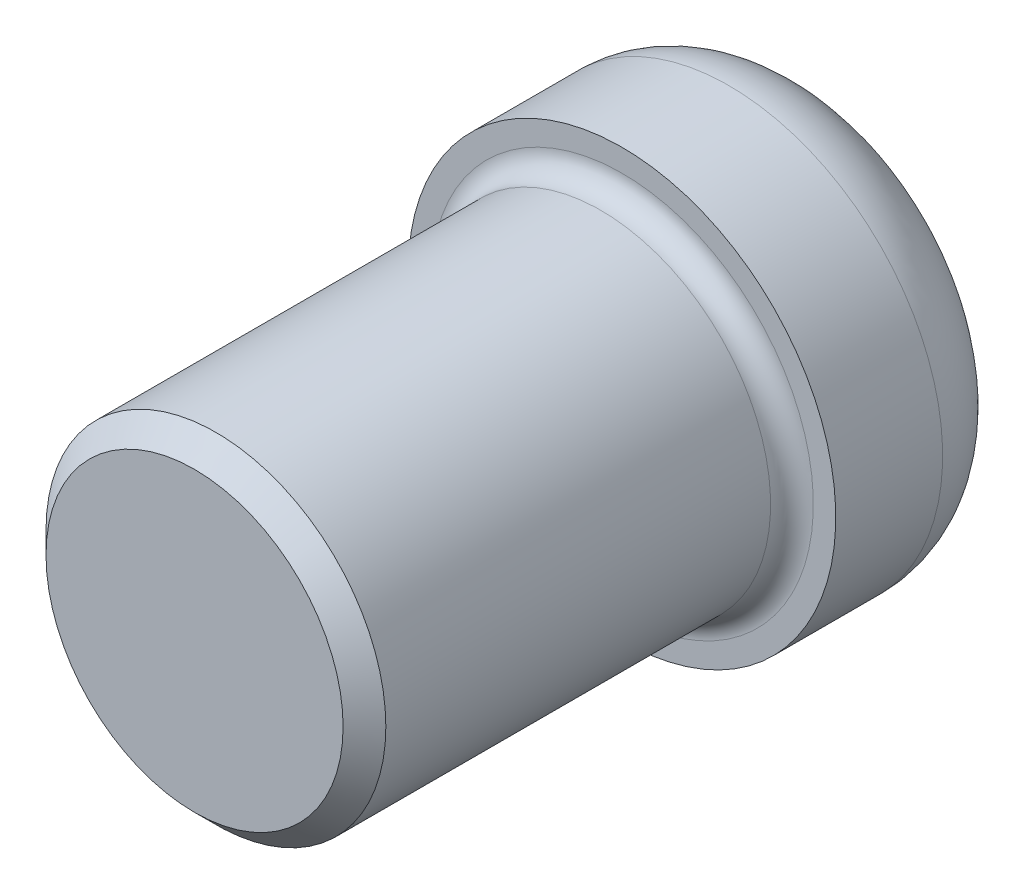
ISO-10303-21;
HEADER;
FILE_DESCRIPTION(('STEP AP214'),'2;1');
FILE_NAME('part.step','',(''),(''),'','','');
FILE_SCHEMA(('AUTOMOTIVE_DESIGN { 1 0 10303 214 1 1 1 1 }'));
ENDSEC;
DATA;
#1=APPLICATION_CONTEXT('core data for automotive mechanical design processes');
#2=APPLICATION_PROTOCOL_DEFINITION('international standard','automotive_design',2000,#1);
#3=PRODUCT_CONTEXT('',#1,'mechanical');
#4=PRODUCT('Part','Part','',(#3));
#5=PRODUCT_RELATED_PRODUCT_CATEGORY('part','',(#4));
#6=PRODUCT_DEFINITION_FORMATION('','',#4);
#7=PRODUCT_DEFINITION_CONTEXT('part definition',#1,'design');
#8=PRODUCT_DEFINITION('design','',#6,#7);
#9=PRODUCT_DEFINITION_SHAPE('','',#8);
#10=(LENGTH_UNIT() NAMED_UNIT(*) SI_UNIT(.MILLI.,.METRE.));
#11=(NAMED_UNIT(*) PLANE_ANGLE_UNIT() SI_UNIT($,.RADIAN.));
#12=(NAMED_UNIT(*) SI_UNIT($,.STERADIAN.) SOLID_ANGLE_UNIT());
#13=UNCERTAINTY_MEASURE_WITH_UNIT(LENGTH_MEASURE(1.E-05),#10,'distance_accuracy_value','');
#14=(GEOMETRIC_REPRESENTATION_CONTEXT(3) GLOBAL_UNCERTAINTY_ASSIGNED_CONTEXT((#13)) GLOBAL_UNIT_ASSIGNED_CONTEXT((#10,
#11,#12)) REPRESENTATION_CONTEXT('',''));
#15=CARTESIAN_POINT('',(0.,0.,0.));
#16=DIRECTION('',(0.,0.,1.));
#17=DIRECTION('',(1.,0.,0.));
#18=AXIS2_PLACEMENT_3D('',#15,#16,#17);
#19=CARTESIAN_POINT('',(0.,0.,10.));
#20=DIRECTION('',(0.,0.,-1.));
#21=DIRECTION('',(-1.,0.,0.));
#22=AXIS2_PLACEMENT_3D('',#19,#20,#21);
#23=CYLINDRICAL_SURFACE('',#22,3.975);
#24=CARTESIAN_POINT('',(0.,0.,9.5));
#25=DIRECTION('',(0.,0.,1.));
#26=DIRECTION('',(1.,0.,0.));
#27=AXIS2_PLACEMENT_3D('',#24,#25,#26);
#28=CIRCLE('',#27,3.975);
#29=CARTESIAN_POINT('',(3.975,0.,9.5));
#30=VERTEX_POINT('',#29);
#31=EDGE_CURVE('E10',#30,#30,#28,.F.);
#32=ORIENTED_EDGE('',*,*,#31,.T.);
#33=EDGE_LOOP('',(#32));
#34=FACE_BOUND('',#33,.T.);
#35=CARTESIAN_POINT('',(0.,0.,0.5));
#36=DIRECTION('',(0.,0.,-1.));
#37=DIRECTION('',(-1.,0.,0.));
#38=AXIS2_PLACEMENT_3D('',#35,#36,#37);
#39=CIRCLE('',#38,3.975);
#40=CARTESIAN_POINT('',(-3.975,0.,0.5));
#41=VERTEX_POINT('',#40);
#42=EDGE_CURVE('E45',#41,#41,#39,.F.);
#43=ORIENTED_EDGE('',*,*,#42,.T.);
#44=EDGE_LOOP('',(#43));
#45=FACE_BOUND('',#44,.T.);
#46=ADVANCED_FACE('F34',(#34,#45),#23,.T.);
#47=CARTESIAN_POINT('',(0.,0.,10.));
#48=DIRECTION('',(0.,0.,1.));
#49=DIRECTION('',(1.,0.,0.));
#50=AXIS2_PLACEMENT_3D('',#47,#48,#49);
#51=PLANE('',#50);
#52=CARTESIAN_POINT('',(0.,0.,10.));
#53=DIRECTION('',(0.,0.,1.));
#54=DIRECTION('',(1.,0.,0.));
#55=AXIS2_PLACEMENT_3D('',#52,#53,#54);
#56=CIRCLE('',#55,3.475);
#57=CARTESIAN_POINT('',(3.475,0.,10.));
#58=VERTEX_POINT('',#57);
#59=EDGE_CURVE('E41',#58,#58,#56,.T.);
#60=ORIENTED_EDGE('',*,*,#59,.T.);
#61=EDGE_LOOP('',(#60));
#62=FACE_BOUND('',#61,.T.);
#63=ADVANCED_FACE('F83',(#62),#51,.T.);
#64=CARTESIAN_POINT('',(0.,0.,-4.5));
#65=DIRECTION('',(0.,0.,1.));
#66=DIRECTION('',(1.,0.,0.));
#67=AXIS2_PLACEMENT_3D('',#64,#65,#66);
#68=CYLINDRICAL_SURFACE('',#67,5.);
#69=CARTESIAN_POINT('',(0.,0.,-2.5));
#70=DIRECTION('',(0.,0.,-1.));
#71=DIRECTION('',(-1.,0.,0.));
#72=AXIS2_PLACEMENT_3D('',#69,#70,#71);
#73=CIRCLE('',#72,5.);
#74=CARTESIAN_POINT('',(-5.,0.,-2.5));
#75=VERTEX_POINT('',#74);
#76=EDGE_CURVE('E54',#75,#75,#73,.F.);
#77=ORIENTED_EDGE('',*,*,#76,.T.);
#78=EDGE_LOOP('',(#77));
#79=FACE_BOUND('',#78,.T.);
#80=CARTESIAN_POINT('',(0.,0.,0.));
#81=DIRECTION('',(0.,0.,-1.));
#82=DIRECTION('',(-1.,0.,0.));
#83=AXIS2_PLACEMENT_3D('',#80,#81,#82);
#84=CIRCLE('',#83,5.);
#85=CARTESIAN_POINT('',(-5.,0.,0.));
#86=VERTEX_POINT('',#85);
#87=EDGE_CURVE('E60',#86,#86,#84,.T.);
#88=ORIENTED_EDGE('',*,*,#87,.T.);
#89=EDGE_LOOP('',(#88));
#90=FACE_BOUND('',#89,.T.);
#91=ADVANCED_FACE('F64',(#79,#90),#68,.T.);
#92=CARTESIAN_POINT('',(0.,0.,-4.5));
#93=DIRECTION('',(0.,0.,-1.));
#94=DIRECTION('',(-1.,0.,0.));
#95=AXIS2_PLACEMENT_3D('',#92,#93,#94);
#96=PLANE('',#95);
#97=CARTESIAN_POINT('',(0.,0.,-4.5));
#98=DIRECTION('',(0.,0.,-1.));
#99=DIRECTION('',(-1.,0.,0.));
#100=AXIS2_PLACEMENT_3D('',#97,#98,#99);
#101=CIRCLE('',#100,3.);
#102=CARTESIAN_POINT('',(-3.,0.,-4.5));
#103=VERTEX_POINT('',#102);
#104=EDGE_CURVE('E57',#103,#103,#101,.T.);
#105=ORIENTED_EDGE('',*,*,#104,.T.);
#106=EDGE_LOOP('',(#105));
#107=FACE_BOUND('',#106,.T.);
#108=ADVANCED_FACE('F69',(#107),#96,.T.);
#109=CARTESIAN_POINT('',(0.,0.,0.));
#110=DIRECTION('',(0.,0.,-1.));
#111=DIRECTION('',(-1.,0.,0.));
#112=AXIS2_PLACEMENT_3D('',#109,#110,#111);
#113=PLANE('',#112);
#114=CARTESIAN_POINT('',(0.,0.,0.));
#115=DIRECTION('',(0.,0.,-1.));
#116=DIRECTION('',(-1.,0.,0.));
#117=AXIS2_PLACEMENT_3D('',#114,#115,#116);
#118=CIRCLE('',#117,4.475);
#119=CARTESIAN_POINT('',(-4.475,0.,0.));
#120=VERTEX_POINT('',#119);
#121=EDGE_CURVE('E49',#120,#120,#118,.T.);
#122=ORIENTED_EDGE('',*,*,#121,.T.);
#123=EDGE_LOOP('',(#122));
#124=FACE_BOUND('',#123,.T.);
#125=ORIENTED_EDGE('',*,*,#87,.F.);
#126=EDGE_LOOP('',(#125));
#127=FACE_BOUND('',#126,.T.);
#128=ADVANCED_FACE('F66',(#124,#127),#113,.F.);
#129=CARTESIAN_POINT('',(0.,0.,-2.5));
#130=DIRECTION('',(0.,0.,-1.));
#131=DIRECTION('',(-1.,0.,0.));
#132=AXIS2_PLACEMENT_3D('',#129,#130,#131);
#133=TOROIDAL_SURFACE('',#132,3.,2.);
#134=ORIENTED_EDGE('',*,*,#76,.F.);
#135=EDGE_LOOP('',(#134));
#136=FACE_BOUND('',#135,.T.);
#137=ORIENTED_EDGE('',*,*,#104,.F.);
#138=EDGE_LOOP('',(#137));
#139=FACE_BOUND('',#138,.T.);
#140=ADVANCED_FACE('F68',(#136,#139),#133,.T.);
#141=CARTESIAN_POINT('',(0.,0.,0.5));
#142=DIRECTION('',(0.,0.,-1.));
#143=DIRECTION('',(-1.,0.,0.));
#144=AXIS2_PLACEMENT_3D('',#141,#142,#143);
#145=TOROIDAL_SURFACE('',#144,4.475,0.5);
#146=ORIENTED_EDGE('',*,*,#42,.F.);
#147=EDGE_LOOP('',(#146));
#148=FACE_BOUND('',#147,.T.);
#149=ORIENTED_EDGE('',*,*,#121,.F.);
#150=EDGE_LOOP('',(#149));
#151=FACE_BOUND('',#150,.T.);
#152=ADVANCED_FACE('F76',(#148,#151),#145,.F.);
#153=CARTESIAN_POINT('',(0.,0.,10.));
#154=DIRECTION('',(0.,0.,-1.));
#155=DIRECTION('',(-1.,0.,0.));
#156=AXIS2_PLACEMENT_3D('',#153,#154,#155);
#157=CONICAL_SURFACE('',#156,3.475,0.785398163397447);
#158=ORIENTED_EDGE('',*,*,#31,.F.);
#159=EDGE_LOOP('',(#158));
#160=FACE_BOUND('',#159,.T.);
#161=ORIENTED_EDGE('',*,*,#59,.F.);
#162=EDGE_LOOP('',(#161));
#163=FACE_BOUND('',#162,.T.);
#164=ADVANCED_FACE('F36',(#160,#163),#157,.T.);
#165=CLOSED_SHELL('',(#46,#63,#91,#108,#128,#140,#152,#164));
#166=MANIFOLD_SOLID_BREP('B2',#165);
#167=ADVANCED_BREP_SHAPE_REPRESENTATION('',(#18,#166),#14);
#168=SHAPE_DEFINITION_REPRESENTATION(#9,#167);
ENDSEC;
END-ISO-10303-21;
